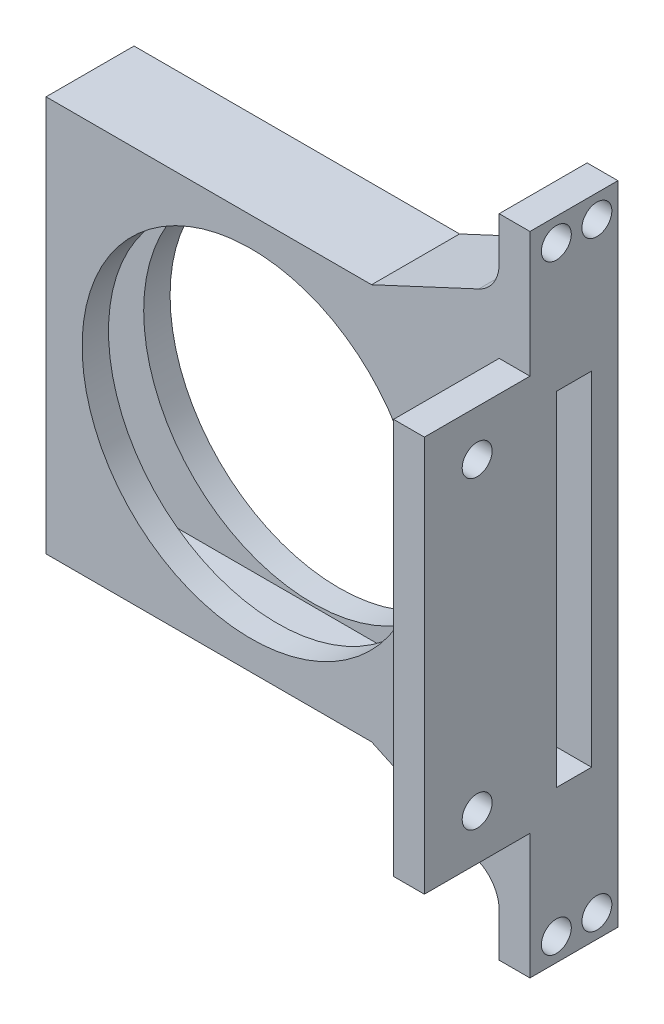
ISO-10303-21;
HEADER;
FILE_DESCRIPTION(('STEP AP214'),'2;1');
FILE_NAME('part.step','',(''),(''),'','','');
FILE_SCHEMA(('AUTOMOTIVE_DESIGN { 1 0 10303 214 1 1 1 1 }'));
ENDSEC;
DATA;
#1=APPLICATION_CONTEXT('core data for automotive mechanical design processes');
#2=APPLICATION_PROTOCOL_DEFINITION('international standard','automotive_design',2000,#1);
#3=PRODUCT_CONTEXT('',#1,'mechanical');
#4=PRODUCT('Part','Part','',(#3));
#5=PRODUCT_RELATED_PRODUCT_CATEGORY('part','',(#4));
#6=PRODUCT_DEFINITION_FORMATION('','',#4);
#7=PRODUCT_DEFINITION_CONTEXT('part definition',#1,'design');
#8=PRODUCT_DEFINITION('design','',#6,#7);
#9=PRODUCT_DEFINITION_SHAPE('','',#8);
#10=(LENGTH_UNIT() NAMED_UNIT(*) SI_UNIT(.MILLI.,.METRE.));
#11=(NAMED_UNIT(*) PLANE_ANGLE_UNIT() SI_UNIT($,.RADIAN.));
#12=(NAMED_UNIT(*) SI_UNIT($,.STERADIAN.) SOLID_ANGLE_UNIT());
#13=UNCERTAINTY_MEASURE_WITH_UNIT(LENGTH_MEASURE(1.E-05),#10,'distance_accuracy_value','');
#14=(GEOMETRIC_REPRESENTATION_CONTEXT(3) GLOBAL_UNCERTAINTY_ASSIGNED_CONTEXT((#13)) GLOBAL_UNIT_ASSIGNED_CONTEXT((#10,
#11,#12)) REPRESENTATION_CONTEXT('',''));
#15=CARTESIAN_POINT('',(0.,0.,0.));
#16=DIRECTION('',(0.,0.,1.));
#17=DIRECTION('',(1.,0.,0.));
#18=AXIS2_PLACEMENT_3D('',#15,#16,#17);
#19=CARTESIAN_POINT('',(-27.5,22.5,3.));
#20=DIRECTION('',(0.,-1.,0.));
#21=DIRECTION('',(0.,0.,-1.));
#22=AXIS2_PLACEMENT_3D('',#19,#20,#21);
#23=PLANE('',#22);
#24=DIRECTION('',(0.,0.,1.));
#25=VECTOR('',#24,1.);
#26=CARTESIAN_POINT('',(9.50000000000001,22.5,-7.));
#27=LINE('',#26,#25);
#28=CARTESIAN_POINT('',(9.50000000000001,22.5,-7.));
#29=VERTEX_POINT('',#28);
#30=CARTESIAN_POINT('',(9.50000000000001,22.5,3.));
#31=VERTEX_POINT('',#30);
#32=EDGE_CURVE('E11',#29,#31,#27,.T.);
#33=ORIENTED_EDGE('',*,*,#32,.F.);
#34=DIRECTION('',(-1.,0.,0.));
#35=VECTOR('',#34,1.);
#36=CARTESIAN_POINT('',(-27.5,22.5,-7.));
#37=LINE('',#36,#35);
#38=CARTESIAN_POINT('',(-27.5,22.5,-7.));
#39=VERTEX_POINT('',#38);
#40=EDGE_CURVE('E200',#29,#39,#37,.T.);
#41=ORIENTED_EDGE('',*,*,#40,.T.);
#42=DIRECTION('',(0.,0.,-1.));
#43=VECTOR('',#42,1.);
#44=CARTESIAN_POINT('',(-27.5,22.5,3.));
#45=LINE('',#44,#43);
#46=CARTESIAN_POINT('',(-27.5,22.5,3.));
#47=VERTEX_POINT('',#46);
#48=EDGE_CURVE('E182',#47,#39,#45,.T.);
#49=ORIENTED_EDGE('',*,*,#48,.F.);
#50=DIRECTION('',(-1.,0.,0.));
#51=VECTOR('',#50,1.);
#52=CARTESIAN_POINT('',(-27.5,22.5,3.));
#53=LINE('',#52,#51);
#54=EDGE_CURVE('E341',#31,#47,#53,.T.);
#55=ORIENTED_EDGE('',*,*,#54,.F.);
#56=EDGE_LOOP('',(#33,#41,#49,#55));
#57=FACE_BOUND('',#56,.T.);
#58=ADVANCED_FACE('F34',(#57),#23,.F.);
#59=CARTESIAN_POINT('',(-27.5,-22.5,3.));
#60=DIRECTION('',(0.,1.,0.));
#61=DIRECTION('',(0.,0.,1.));
#62=AXIS2_PLACEMENT_3D('',#59,#60,#61);
#63=PLANE('',#62);
#64=DIRECTION('',(-1.,0.,0.));
#65=VECTOR('',#64,1.);
#66=CARTESIAN_POINT('',(27.5,-22.5,3.));
#67=LINE('',#66,#65);
#68=CARTESIAN_POINT('',(27.5,-22.5,3.));
#69=VERTEX_POINT('',#68);
#70=CARTESIAN_POINT('',(24.,-22.5,3.));
#71=VERTEX_POINT('',#70);
#72=EDGE_CURVE('E273',#69,#71,#67,.T.);
#73=ORIENTED_EDGE('',*,*,#72,.F.);
#74=DIRECTION('',(0.,0.,-1.));
#75=VECTOR('',#74,1.);
#76=CARTESIAN_POINT('',(27.5,-22.5,3.));
#77=LINE('',#76,#75);
#78=CARTESIAN_POINT('',(27.5,-22.5,15.));
#79=VERTEX_POINT('',#78);
#80=EDGE_CURVE('E183',#79,#69,#77,.T.);
#81=ORIENTED_EDGE('',*,*,#80,.F.);
#82=DIRECTION('',(1.,0.,0.));
#83=VECTOR('',#82,1.);
#84=CARTESIAN_POINT('',(24.,-22.5,15.));
#85=LINE('',#84,#83);
#86=CARTESIAN_POINT('',(24.,-22.5,15.));
#87=VERTEX_POINT('',#86);
#88=EDGE_CURVE('E322',#87,#79,#85,.T.);
#89=ORIENTED_EDGE('',*,*,#88,.F.);
#90=DIRECTION('',(0.,0.,-1.));
#91=VECTOR('',#90,1.);
#92=CARTESIAN_POINT('',(24.,-22.5,15.));
#93=LINE('',#92,#91);
#94=EDGE_CURVE('E332',#87,#71,#93,.T.);
#95=ORIENTED_EDGE('',*,*,#94,.T.);
#96=EDGE_LOOP('',(#73,#81,#89,#95));
#97=FACE_BOUND('',#96,.T.);
#98=ADVANCED_FACE('F373',(#97),#63,.F.);
#99=CARTESIAN_POINT('',(27.5,22.5,3.));
#100=DIRECTION('',(-1.,0.,0.));
#101=DIRECTION('',(0.,-1.,0.));
#102=AXIS2_PLACEMENT_3D('',#99,#100,#101);
#103=PLANE('',#102);
#104=DIRECTION('',(0.,0.,1.));
#105=VECTOR('',#104,1.);
#106=CARTESIAN_POINT('',(27.5,-19.5,0.));
#107=LINE('',#106,#105);
#108=CARTESIAN_POINT('',(27.5,-19.5,-4.));
#109=VERTEX_POINT('',#108);
#110=CARTESIAN_POINT('',(27.5,-19.5,0.));
#111=VERTEX_POINT('',#110);
#112=EDGE_CURVE('E747',#109,#111,#107,.T.);
#113=ORIENTED_EDGE('',*,*,#112,.T.);
#114=DIRECTION('',(0.,1.,0.));
#115=VECTOR('',#114,1.);
#116=CARTESIAN_POINT('',(27.5,22.5,0.));
#117=LINE('',#116,#115);
#118=CARTESIAN_POINT('',(27.5,19.5,0.));
#119=VERTEX_POINT('',#118);
#120=EDGE_CURVE('E340',#111,#119,#117,.T.);
#121=ORIENTED_EDGE('',*,*,#120,.T.);
#122=DIRECTION('',(0.,0.,1.));
#123=VECTOR('',#122,1.);
#124=CARTESIAN_POINT('',(27.5,19.5,0.));
#125=LINE('',#124,#123);
#126=CARTESIAN_POINT('',(27.5,19.5,-4.));
#127=VERTEX_POINT('',#126);
#128=EDGE_CURVE('E735',#127,#119,#125,.T.);
#129=ORIENTED_EDGE('',*,*,#128,.F.);
#130=DIRECTION('',(0.,1.,0.));
#131=VECTOR('',#130,1.);
#132=CARTESIAN_POINT('',(27.5,22.5,-4.));
#133=LINE('',#132,#131);
#134=EDGE_CURVE('E206',#109,#127,#133,.T.);
#135=ORIENTED_EDGE('',*,*,#134,.F.);
#136=EDGE_LOOP('',(#113,#121,#129,#135));
#137=FACE_BOUND('',#136,.T.);
#138=CARTESIAN_POINT('',(27.5,34.1294345757057,0.));
#139=DIRECTION('',(1.,0.,0.));
#140=DIRECTION('',(0.,0.,1.));
#141=AXIS2_PLACEMENT_3D('',#138,#139,#140);
#142=CIRCLE('',#141,1.7);
#143=CARTESIAN_POINT('',(27.5,34.1294345757057,1.7));
#144=VERTEX_POINT('',#143);
#145=EDGE_CURVE('E214',#144,#144,#142,.T.);
#146=ORIENTED_EDGE('',*,*,#145,.F.);
#147=EDGE_LOOP('',(#146));
#148=FACE_BOUND('',#147,.T.);
#149=CARTESIAN_POINT('',(27.5,34.1294345757057,-4.60789842364382));
#150=DIRECTION('',(1.,0.,0.));
#151=DIRECTION('',(0.,0.,1.));
#152=AXIS2_PLACEMENT_3D('',#149,#150,#151);
#153=CIRCLE('',#152,1.7);
#154=CARTESIAN_POINT('',(27.5,34.1294345757057,-2.90789842364382));
#155=VERTEX_POINT('',#154);
#156=EDGE_CURVE('E221',#155,#155,#153,.T.);
#157=ORIENTED_EDGE('',*,*,#156,.F.);
#158=EDGE_LOOP('',(#157));
#159=FACE_BOUND('',#158,.T.);
#160=CARTESIAN_POINT('',(27.5,-34.1294345757057,0.));
#161=DIRECTION('',(-1.,0.,0.));
#162=DIRECTION('',(0.,0.,1.));
#163=AXIS2_PLACEMENT_3D('',#160,#161,#162);
#164=CIRCLE('',#163,1.7);
#165=CARTESIAN_POINT('',(27.5,-34.1294345757057,1.7));
#166=VERTEX_POINT('',#165);
#167=EDGE_CURVE('E260',#166,#166,#164,.T.);
#168=ORIENTED_EDGE('',*,*,#167,.T.);
#169=EDGE_LOOP('',(#168));
#170=FACE_BOUND('',#169,.T.);
#171=CARTESIAN_POINT('',(27.5,-34.1294345757057,-4.60789842364382));
#172=DIRECTION('',(-1.,0.,0.));
#173=DIRECTION('',(0.,0.,1.));
#174=AXIS2_PLACEMENT_3D('',#171,#172,#173);
#175=CIRCLE('',#174,1.7);
#176=CARTESIAN_POINT('',(27.5,-34.1294345757057,-2.90789842364382));
#177=VERTEX_POINT('',#176);
#178=EDGE_CURVE('E267',#177,#177,#175,.T.);
#179=ORIENTED_EDGE('',*,*,#178,.T.);
#180=EDGE_LOOP('',(#179));
#181=FACE_BOUND('',#180,.T.);
#182=CARTESIAN_POINT('',(27.5,-17.3,9.));
#183=DIRECTION('',(-1.,0.,0.));
#184=DIRECTION('',(0.,-1.,0.));
#185=AXIS2_PLACEMENT_3D('',#182,#183,#184);
#186=CIRCLE('',#185,1.7);
#187=CARTESIAN_POINT('',(27.5,-19.,9.));
#188=VERTEX_POINT('',#187);
#189=EDGE_CURVE('E310',#188,#188,#186,.T.);
#190=ORIENTED_EDGE('',*,*,#189,.T.);
#191=EDGE_LOOP('',(#190));
#192=FACE_BOUND('',#191,.T.);
#193=CARTESIAN_POINT('',(27.5,17.3,9.));
#194=DIRECTION('',(-1.,0.,0.));
#195=DIRECTION('',(0.,-1.,0.));
#196=AXIS2_PLACEMENT_3D('',#193,#194,#195);
#197=CIRCLE('',#196,1.7);
#198=CARTESIAN_POINT('',(27.5,15.6,9.));
#199=VERTEX_POINT('',#198);
#200=EDGE_CURVE('E317',#199,#199,#197,.T.);
#201=ORIENTED_EDGE('',*,*,#200,.T.);
#202=EDGE_LOOP('',(#201));
#203=FACE_BOUND('',#202,.T.);
#204=DIRECTION('',(0.,1.,0.));
#205=VECTOR('',#204,1.);
#206=CARTESIAN_POINT('',(27.5,-36.7445222988039,-7.));
#207=LINE('',#206,#205);
#208=CARTESIAN_POINT('',(27.5,-36.7445222988039,-7.));
#209=VERTEX_POINT('',#208);
#210=CARTESIAN_POINT('',(27.5,36.7445222988039,-7.));
#211=VERTEX_POINT('',#210);
#212=EDGE_CURVE('E287',#209,#211,#207,.T.);
#213=ORIENTED_EDGE('',*,*,#212,.T.);
#214=DIRECTION('',(0.,0.,1.));
#215=VECTOR('',#214,1.);
#216=CARTESIAN_POINT('',(27.5,36.7445222988039,-7.));
#217=LINE('',#216,#215);
#218=CARTESIAN_POINT('',(27.5,36.7445222988039,3.));
#219=VERTEX_POINT('',#218);
#220=EDGE_CURVE('E250',#211,#219,#217,.T.);
#221=ORIENTED_EDGE('',*,*,#220,.T.);
#222=DIRECTION('',(0.,-1.,0.));
#223=VECTOR('',#222,1.);
#224=CARTESIAN_POINT('',(27.5,36.7445222988039,3.));
#225=LINE('',#224,#223);
#226=CARTESIAN_POINT('',(27.5,22.5,3.));
#227=VERTEX_POINT('',#226);
#228=EDGE_CURVE('E217',#219,#227,#225,.T.);
#229=ORIENTED_EDGE('',*,*,#228,.T.);
#230=DIRECTION('',(0.,0.,-1.));
#231=VECTOR('',#230,1.);
#232=CARTESIAN_POINT('',(27.5,22.5,3.));
#233=LINE('',#232,#231);
#234=CARTESIAN_POINT('',(27.5,22.5,15.));
#235=VERTEX_POINT('',#234);
#236=EDGE_CURVE('E309',#235,#227,#233,.T.);
#237=ORIENTED_EDGE('',*,*,#236,.F.);
#238=DIRECTION('',(0.,1.,0.));
#239=VECTOR('',#238,1.);
#240=CARTESIAN_POINT('',(27.5,-22.5,15.));
#241=LINE('',#240,#239);
#242=EDGE_CURVE('E325',#79,#235,#241,.T.);
#243=ORIENTED_EDGE('',*,*,#242,.F.);
#244=ORIENTED_EDGE('',*,*,#80,.T.);
#245=DIRECTION('',(0.,1.,0.));
#246=VECTOR('',#245,1.);
#247=CARTESIAN_POINT('',(27.5,-36.7445222988039,3.));
#248=LINE('',#247,#246);
#249=CARTESIAN_POINT('',(27.5,-36.7445222988039,3.));
#250=VERTEX_POINT('',#249);
#251=EDGE_CURVE('E263',#250,#69,#248,.T.);
#252=ORIENTED_EDGE('',*,*,#251,.F.);
#253=DIRECTION('',(0.,0.,1.));
#254=VECTOR('',#253,1.);
#255=CARTESIAN_POINT('',(27.5,-36.7445222988039,-7.));
#256=LINE('',#255,#254);
#257=EDGE_CURVE('E300',#209,#250,#256,.T.);
#258=ORIENTED_EDGE('',*,*,#257,.F.);
#259=EDGE_LOOP('',(#213,#221,#229,#237,#243,#244,#252,#258));
#260=FACE_BOUND('',#259,.T.);
#261=ADVANCED_FACE('F36',(#137,#148,#159,#170,#181,#192,#203,#260),#103,.F.);
#262=ORIENTED_EDGE('',*,*,#236,.T.);
#263=DIRECTION('',(-1.,0.,0.));
#264=VECTOR('',#263,1.);
#265=CARTESIAN_POINT('',(27.5,22.5,3.));
#266=LINE('',#265,#264);
#267=CARTESIAN_POINT('',(24.,22.5,3.));
#268=VERTEX_POINT('',#267);
#269=EDGE_CURVE('E240',#227,#268,#266,.T.);
#270=ORIENTED_EDGE('',*,*,#269,.T.);
#271=DIRECTION('',(0.,0.,-1.));
#272=VECTOR('',#271,1.);
#273=CARTESIAN_POINT('',(24.,22.5,15.));
#274=LINE('',#273,#272);
#275=CARTESIAN_POINT('',(24.,22.5,15.));
#276=VERTEX_POINT('',#275);
#277=EDGE_CURVE('E337',#276,#268,#274,.T.);
#278=ORIENTED_EDGE('',*,*,#277,.F.);
#279=DIRECTION('',(-1.,0.,0.));
#280=VECTOR('',#279,1.);
#281=CARTESIAN_POINT('',(27.5,22.5,15.));
#282=LINE('',#281,#280);
#283=EDGE_CURVE('E328',#235,#276,#282,.T.);
#284=ORIENTED_EDGE('',*,*,#283,.F.);
#285=EDGE_LOOP('',(#262,#270,#278,#284));
#286=FACE_BOUND('',#285,.T.);
#287=ADVANCED_FACE('F375',(#286),#23,.F.);
#288=CARTESIAN_POINT('',(-27.5,22.5,3.));
#289=DIRECTION('',(1.,0.,0.));
#290=DIRECTION('',(0.,1.,0.));
#291=AXIS2_PLACEMENT_3D('',#288,#289,#290);
#292=PLANE('',#291);
#293=DIRECTION('',(0.,0.,-1.));
#294=VECTOR('',#293,1.);
#295=CARTESIAN_POINT('',(-27.5,19.5,-4.));
#296=LINE('',#295,#294);
#297=CARTESIAN_POINT('',(-27.5,19.5,0.));
#298=VERTEX_POINT('',#297);
#299=CARTESIAN_POINT('',(-27.5,19.5,-4.));
#300=VERTEX_POINT('',#299);
#301=EDGE_CURVE('E737',#298,#300,#296,.T.);
#302=ORIENTED_EDGE('',*,*,#301,.F.);
#303=DIRECTION('',(0.,-1.,0.));
#304=VECTOR('',#303,1.);
#305=CARTESIAN_POINT('',(-27.5,22.5,0.));
#306=LINE('',#305,#304);
#307=CARTESIAN_POINT('',(-27.5,-19.5,0.));
#308=VERTEX_POINT('',#307);
#309=EDGE_CURVE('E51',#298,#308,#306,.T.);
#310=ORIENTED_EDGE('',*,*,#309,.T.);
#311=DIRECTION('',(0.,0.,-1.));
#312=VECTOR('',#311,1.);
#313=CARTESIAN_POINT('',(-27.5,-19.5,-4.));
#314=LINE('',#313,#312);
#315=CARTESIAN_POINT('',(-27.5,-19.5,-4.));
#316=VERTEX_POINT('',#315);
#317=EDGE_CURVE('E752',#308,#316,#314,.T.);
#318=ORIENTED_EDGE('',*,*,#317,.T.);
#319=DIRECTION('',(0.,-1.,0.));
#320=VECTOR('',#319,1.);
#321=CARTESIAN_POINT('',(-27.5,22.5,-4.));
#322=LINE('',#321,#320);
#323=EDGE_CURVE('E195',#300,#316,#322,.T.);
#324=ORIENTED_EDGE('',*,*,#323,.F.);
#325=EDGE_LOOP('',(#302,#310,#318,#324));
#326=FACE_BOUND('',#325,.T.);
#327=ORIENTED_EDGE('',*,*,#48,.T.);
#328=DIRECTION('',(0.,-1.,0.));
#329=VECTOR('',#328,1.);
#330=CARTESIAN_POINT('',(-27.5,22.5,-7.));
#331=LINE('',#330,#329);
#332=CARTESIAN_POINT('',(-27.5,-22.5,-7.));
#333=VERTEX_POINT('',#332);
#334=EDGE_CURVE('E191',#39,#333,#331,.T.);
#335=ORIENTED_EDGE('',*,*,#334,.T.);
#336=DIRECTION('',(0.,0.,-1.));
#337=VECTOR('',#336,1.);
#338=CARTESIAN_POINT('',(-27.5,-22.5,3.));
#339=LINE('',#338,#337);
#340=CARTESIAN_POINT('',(-27.5,-22.5,3.));
#341=VERTEX_POINT('',#340);
#342=EDGE_CURVE('E172',#341,#333,#339,.T.);
#343=ORIENTED_EDGE('',*,*,#342,.F.);
#344=DIRECTION('',(0.,-1.,0.));
#345=VECTOR('',#344,1.);
#346=CARTESIAN_POINT('',(-27.5,22.5,3.));
#347=LINE('',#346,#345);
#348=EDGE_CURVE('E343',#47,#341,#347,.T.);
#349=ORIENTED_EDGE('',*,*,#348,.F.);
#350=EDGE_LOOP('',(#327,#335,#343,#349));
#351=FACE_BOUND('',#350,.T.);
#352=ADVANCED_FACE('F197',(#326,#351),#292,.F.);
#353=ORIENTED_EDGE('',*,*,#342,.T.);
#354=DIRECTION('',(1.,0.,0.));
#355=VECTOR('',#354,1.);
#356=CARTESIAN_POINT('',(-27.5,-22.5,-7.));
#357=LINE('',#356,#355);
#358=CARTESIAN_POINT('',(9.50000000000001,-22.5,-7.));
#359=VERTEX_POINT('',#358);
#360=EDGE_CURVE('E176',#333,#359,#357,.T.);
#361=ORIENTED_EDGE('',*,*,#360,.T.);
#362=DIRECTION('',(0.,0.,1.));
#363=VECTOR('',#362,1.);
#364=CARTESIAN_POINT('',(9.50000000000001,-22.5,-7.));
#365=LINE('',#364,#363);
#366=CARTESIAN_POINT('',(9.50000000000001,-22.5,3.));
#367=VERTEX_POINT('',#366);
#368=EDGE_CURVE('E43',#359,#367,#365,.T.);
#369=ORIENTED_EDGE('',*,*,#368,.T.);
#370=DIRECTION('',(1.,0.,0.));
#371=VECTOR('',#370,1.);
#372=CARTESIAN_POINT('',(-27.5,-22.5,3.));
#373=LINE('',#372,#371);
#374=EDGE_CURVE('E178',#341,#367,#373,.T.);
#375=ORIENTED_EDGE('',*,*,#374,.F.);
#376=EDGE_LOOP('',(#353,#361,#369,#375));
#377=FACE_BOUND('',#376,.T.);
#378=ADVANCED_FACE('F174',(#377),#63,.F.);
#379=CARTESIAN_POINT('',(0.,0.,3.));
#380=DIRECTION('',(0.,0.,1.));
#381=DIRECTION('',(1.,0.,0.));
#382=AXIS2_PLACEMENT_3D('',#379,#380,#381);
#383=PLANE('',#382);
#384=CARTESIAN_POINT('',(-4.20497735726996,0.,3.));
#385=DIRECTION('',(0.,0.,1.));
#386=DIRECTION('',(1.,0.,0.));
#387=AXIS2_PLACEMENT_3D('',#384,#385,#386);
#388=CIRCLE('',#387,19.2);
#389=CARTESIAN_POINT('',(14.99502264273,0.,3.));
#390=VERTEX_POINT('',#389);
#391=EDGE_CURVE('E210',#390,#390,#388,.T.);
#392=ORIENTED_EDGE('',*,*,#391,.F.);
#393=EDGE_LOOP('',(#392));
#394=FACE_BOUND('',#393,.T.);
#395=DIRECTION('',(0.,-1.,0.));
#396=VECTOR('',#395,1.);
#397=CARTESIAN_POINT('',(24.,22.5,3.));
#398=LINE('',#397,#396);
#399=EDGE_CURVE('E313',#268,#71,#398,.T.);
#400=ORIENTED_EDGE('',*,*,#399,.F.);
#401=ORIENTED_EDGE('',*,*,#269,.F.);
#402=ORIENTED_EDGE('',*,*,#228,.F.);
#403=DIRECTION('',(1.,0.,0.));
#404=VECTOR('',#403,1.);
#405=CARTESIAN_POINT('',(27.5,36.7445222988039,3.));
#406=LINE('',#405,#404);
#407=CARTESIAN_POINT('',(24.,36.7445222988039,3.));
#408=VERTEX_POINT('',#407);
#409=EDGE_CURVE('E228',#408,#219,#406,.T.);
#410=ORIENTED_EDGE('',*,*,#409,.F.);
#411=DIRECTION('',(0.,1.,0.));
#412=VECTOR('',#411,1.);
#413=CARTESIAN_POINT('',(24.,36.7445222988039,3.));
#414=LINE('',#413,#412);
#415=CARTESIAN_POINT('',(24.,31.8046874169359,3.));
#416=VERTEX_POINT('',#415);
#417=EDGE_CURVE('E231',#416,#408,#414,.T.);
#418=ORIENTED_EDGE('',*,*,#417,.F.);
#419=CARTESIAN_POINT('',(20.,31.8046874169359,3.));
#420=DIRECTION('',(0.,0.,1.));
#421=DIRECTION('',(1.,0.,0.));
#422=AXIS2_PLACEMENT_3D('',#419,#420,#421);
#423=CIRCLE('',#422,4.);
#424=CARTESIAN_POINT('',(21.6892379962709,28.1788806112781,3.));
#425=VERTEX_POINT('',#424);
#426=EDGE_CURVE('E234',#425,#416,#423,.T.);
#427=ORIENTED_EDGE('',*,*,#426,.F.);
#428=DIRECTION('',(0.906451701414455,0.422309499067733,0.));
#429=VECTOR('',#428,1.);
#430=CARTESIAN_POINT('',(9.50000000000001,22.5,3.));
#431=LINE('',#430,#429);
#432=EDGE_CURVE('E237',#31,#425,#431,.T.);
#433=ORIENTED_EDGE('',*,*,#432,.F.);
#434=ORIENTED_EDGE('',*,*,#54,.T.);
#435=ORIENTED_EDGE('',*,*,#348,.T.);
#436=ORIENTED_EDGE('',*,*,#374,.T.);
#437=DIRECTION('',(0.906451701414455,-0.422309499067733,0.));
#438=VECTOR('',#437,1.);
#439=CARTESIAN_POINT('',(9.50000000000001,-22.5,3.));
#440=LINE('',#439,#438);
#441=CARTESIAN_POINT('',(21.6892379962709,-28.1788806112781,3.));
#442=VERTEX_POINT('',#441);
#443=EDGE_CURVE('E275',#367,#442,#440,.T.);
#444=ORIENTED_EDGE('',*,*,#443,.T.);
#445=CARTESIAN_POINT('',(20.,-31.8046874169359,3.));
#446=DIRECTION('',(0.,0.,-1.));
#447=DIRECTION('',(1.,0.,0.));
#448=AXIS2_PLACEMENT_3D('',#445,#446,#447);
#449=CIRCLE('',#448,4.);
#450=CARTESIAN_POINT('',(24.,-31.8046874169359,3.));
#451=VERTEX_POINT('',#450);
#452=EDGE_CURVE('E278',#442,#451,#449,.T.);
#453=ORIENTED_EDGE('',*,*,#452,.T.);
#454=DIRECTION('',(0.,-1.,0.));
#455=VECTOR('',#454,1.);
#456=CARTESIAN_POINT('',(24.,-36.7445222988039,3.));
#457=LINE('',#456,#455);
#458=CARTESIAN_POINT('',(24.,-36.7445222988039,3.));
#459=VERTEX_POINT('',#458);
#460=EDGE_CURVE('E281',#451,#459,#457,.T.);
#461=ORIENTED_EDGE('',*,*,#460,.T.);
#462=DIRECTION('',(1.,0.,0.));
#463=VECTOR('',#462,1.);
#464=CARTESIAN_POINT('',(27.5,-36.7445222988039,3.));
#465=LINE('',#464,#463);
#466=EDGE_CURVE('E284',#459,#250,#465,.T.);
#467=ORIENTED_EDGE('',*,*,#466,.T.);
#468=ORIENTED_EDGE('',*,*,#251,.T.);
#469=ORIENTED_EDGE('',*,*,#72,.T.);
#470=EDGE_LOOP('',(#400,#401,#402,#410,#418,#427,#433,#434,#435,#436,#444,#453,#461,#467,#468,#469));
#471=FACE_BOUND('',#470,.T.);
#472=ADVANCED_FACE('F400',(#394,#471),#383,.T.);
#473=CARTESIAN_POINT('',(0.,0.,0.));
#474=DIRECTION('',(0.,0.,1.));
#475=DIRECTION('',(1.,0.,0.));
#476=AXIS2_PLACEMENT_3D('',#473,#474,#475);
#477=PLANE('',#476);
#478=CARTESIAN_POINT('',(-4.20497735726996,0.,0.));
#479=DIRECTION('',(0.,0.,1.));
#480=DIRECTION('',(1.,0.,0.));
#481=AXIS2_PLACEMENT_3D('',#478,#479,#480);
#482=CIRCLE('',#481,19.2);
#483=CARTESIAN_POINT('',(14.99502264273,0.,0.));
#484=VERTEX_POINT('',#483);
#485=EDGE_CURVE('E202',#484,#484,#482,.T.);
#486=ORIENTED_EDGE('',*,*,#485,.T.);
#487=EDGE_LOOP('',(#486));
#488=FACE_BOUND('',#487,.T.);
#489=ORIENTED_EDGE('',*,*,#309,.F.);
#490=DIRECTION('',(-1.,0.,0.));
#491=VECTOR('',#490,1.);
#492=CARTESIAN_POINT('',(-27.5,19.5,0.));
#493=LINE('',#492,#491);
#494=EDGE_CURVE('E55',#119,#298,#493,.T.);
#495=ORIENTED_EDGE('',*,*,#494,.F.);
#496=ORIENTED_EDGE('',*,*,#120,.F.);
#497=DIRECTION('',(-1.,0.,0.));
#498=VECTOR('',#497,1.);
#499=CARTESIAN_POINT('',(-27.5,-19.5,0.));
#500=LINE('',#499,#498);
#501=EDGE_CURVE('E750',#111,#308,#500,.T.);
#502=ORIENTED_EDGE('',*,*,#501,.T.);
#503=EDGE_LOOP('',(#489,#495,#496,#502));
#504=FACE_BOUND('',#503,.T.);
#505=ADVANCED_FACE('F354',(#488,#504),#477,.F.);
#506=CARTESIAN_POINT('',(24.,22.5,15.));
#507=DIRECTION('',(1.,0.,0.));
#508=DIRECTION('',(0.,1.,0.));
#509=AXIS2_PLACEMENT_3D('',#506,#507,#508);
#510=PLANE('',#509);
#511=CARTESIAN_POINT('',(24.,-17.3,9.));
#512=DIRECTION('',(-1.,0.,0.));
#513=DIRECTION('',(0.,-1.,0.));
#514=AXIS2_PLACEMENT_3D('',#511,#512,#513);
#515=CIRCLE('',#514,1.7);
#516=CARTESIAN_POINT('',(24.,-19.,9.));
#517=VERTEX_POINT('',#516);
#518=EDGE_CURVE('E314',#517,#517,#515,.T.);
#519=ORIENTED_EDGE('',*,*,#518,.F.);
#520=EDGE_LOOP('',(#519));
#521=FACE_BOUND('',#520,.T.);
#522=CARTESIAN_POINT('',(24.,17.3,9.));
#523=DIRECTION('',(-1.,0.,0.));
#524=DIRECTION('',(0.,-1.,0.));
#525=AXIS2_PLACEMENT_3D('',#522,#523,#524);
#526=CIRCLE('',#525,1.7);
#527=CARTESIAN_POINT('',(24.,15.6,9.));
#528=VERTEX_POINT('',#527);
#529=EDGE_CURVE('E302',#528,#528,#526,.T.);
#530=ORIENTED_EDGE('',*,*,#529,.F.);
#531=EDGE_LOOP('',(#530));
#532=FACE_BOUND('',#531,.T.);
#533=ORIENTED_EDGE('',*,*,#399,.T.);
#534=ORIENTED_EDGE('',*,*,#94,.F.);
#535=DIRECTION('',(0.,-1.,0.));
#536=VECTOR('',#535,1.);
#537=CARTESIAN_POINT('',(24.,22.5,15.));
#538=LINE('',#537,#536);
#539=EDGE_CURVE('E330',#276,#87,#538,.T.);
#540=ORIENTED_EDGE('',*,*,#539,.F.);
#541=ORIENTED_EDGE('',*,*,#277,.T.);
#542=EDGE_LOOP('',(#533,#534,#540,#541));
#543=FACE_BOUND('',#542,.T.);
#544=ADVANCED_FACE('F405',(#521,#532,#543),#510,.F.);
#545=CARTESIAN_POINT('',(0.,0.,15.));
#546=DIRECTION('',(0.,0.,1.));
#547=DIRECTION('',(1.,0.,0.));
#548=AXIS2_PLACEMENT_3D('',#545,#546,#547);
#549=PLANE('',#548);
#550=ORIENTED_EDGE('',*,*,#88,.T.);
#551=ORIENTED_EDGE('',*,*,#242,.T.);
#552=ORIENTED_EDGE('',*,*,#283,.T.);
#553=ORIENTED_EDGE('',*,*,#539,.T.);
#554=EDGE_LOOP('',(#550,#551,#552,#553));
#555=FACE_BOUND('',#554,.T.);
#556=ADVANCED_FACE('F408',(#555),#549,.T.);
#557=CARTESIAN_POINT('',(27.5,17.3,9.));
#558=DIRECTION('',(-1.,0.,0.));
#559=DIRECTION('',(0.,-1.,0.));
#560=AXIS2_PLACEMENT_3D('',#557,#558,#559);
#561=CYLINDRICAL_SURFACE('',#560,1.7);
#562=ORIENTED_EDGE('',*,*,#200,.F.);
#563=EDGE_LOOP('',(#562));
#564=FACE_BOUND('',#563,.T.);
#565=ORIENTED_EDGE('',*,*,#529,.T.);
#566=EDGE_LOOP('',(#565));
#567=FACE_BOUND('',#566,.T.);
#568=ADVANCED_FACE('F459',(#564,#567),#561,.F.);
#569=CARTESIAN_POINT('',(27.5,-17.3,9.));
#570=DIRECTION('',(-1.,0.,0.));
#571=DIRECTION('',(0.,-1.,0.));
#572=AXIS2_PLACEMENT_3D('',#569,#570,#571);
#573=CYLINDRICAL_SURFACE('',#572,1.7);
#574=ORIENTED_EDGE('',*,*,#189,.F.);
#575=EDGE_LOOP('',(#574));
#576=FACE_BOUND('',#575,.T.);
#577=ORIENTED_EDGE('',*,*,#518,.T.);
#578=EDGE_LOOP('',(#577));
#579=FACE_BOUND('',#578,.T.);
#580=ADVANCED_FACE('F449',(#576,#579),#573,.F.);
#581=CARTESIAN_POINT('',(27.5,-36.7445222988039,-7.));
#582=DIRECTION('',(0.,-1.,0.));
#583=DIRECTION('',(1.,0.,0.));
#584=AXIS2_PLACEMENT_3D('',#581,#582,#583);
#585=PLANE('',#584);
#586=ORIENTED_EDGE('',*,*,#257,.T.);
#587=ORIENTED_EDGE('',*,*,#466,.F.);
#588=DIRECTION('',(0.,0.,1.));
#589=VECTOR('',#588,1.);
#590=CARTESIAN_POINT('',(24.,-36.7445222988039,-7.));
#591=LINE('',#590,#589);
#592=CARTESIAN_POINT('',(24.,-36.7445222988039,-7.));
#593=VERTEX_POINT('',#592);
#594=EDGE_CURVE('E303',#593,#459,#591,.T.);
#595=ORIENTED_EDGE('',*,*,#594,.F.);
#596=DIRECTION('',(1.,0.,0.));
#597=VECTOR('',#596,1.);
#598=CARTESIAN_POINT('',(27.5,-36.7445222988039,-7.));
#599=LINE('',#598,#597);
#600=EDGE_CURVE('E296',#593,#209,#599,.T.);
#601=ORIENTED_EDGE('',*,*,#600,.T.);
#602=EDGE_LOOP('',(#586,#587,#595,#601));
#603=FACE_BOUND('',#602,.T.);
#604=ADVANCED_FACE('F413',(#603),#585,.T.);
#605=CARTESIAN_POINT('',(24.,-36.7445222988039,-7.));
#606=DIRECTION('',(-1.,0.,0.));
#607=DIRECTION('',(0.,-1.,0.));
#608=AXIS2_PLACEMENT_3D('',#605,#606,#607);
#609=PLANE('',#608);
#610=CARTESIAN_POINT('',(24.,-34.1294345757057,0.));
#611=DIRECTION('',(-1.,0.,0.));
#612=DIRECTION('',(0.,0.,1.));
#613=AXIS2_PLACEMENT_3D('',#610,#611,#612);
#614=CIRCLE('',#613,1.7);
#615=CARTESIAN_POINT('',(24.,-34.1294345757057,1.7));
#616=VERTEX_POINT('',#615);
#617=EDGE_CURVE('E264',#616,#616,#614,.T.);
#618=ORIENTED_EDGE('',*,*,#617,.F.);
#619=EDGE_LOOP('',(#618));
#620=FACE_BOUND('',#619,.T.);
#621=CARTESIAN_POINT('',(24.,-34.1294345757057,-4.60789842364382));
#622=DIRECTION('',(-1.,0.,0.));
#623=DIRECTION('',(0.,0.,1.));
#624=AXIS2_PLACEMENT_3D('',#621,#622,#623);
#625=CIRCLE('',#624,1.7);
#626=CARTESIAN_POINT('',(24.,-34.1294345757057,-2.90789842364382));
#627=VERTEX_POINT('',#626);
#628=EDGE_CURVE('E254',#627,#627,#625,.T.);
#629=ORIENTED_EDGE('',*,*,#628,.F.);
#630=EDGE_LOOP('',(#629));
#631=FACE_BOUND('',#630,.T.);
#632=ORIENTED_EDGE('',*,*,#594,.T.);
#633=ORIENTED_EDGE('',*,*,#460,.F.);
#634=DIRECTION('',(0.,0.,1.));
#635=VECTOR('',#634,1.);
#636=CARTESIAN_POINT('',(24.,-31.8046874169359,-7.));
#637=LINE('',#636,#635);
#638=CARTESIAN_POINT('',(24.,-31.8046874169359,-7.));
#639=VERTEX_POINT('',#638);
#640=EDGE_CURVE('E305',#639,#451,#637,.T.);
#641=ORIENTED_EDGE('',*,*,#640,.F.);
#642=DIRECTION('',(0.,-1.,0.));
#643=VECTOR('',#642,1.);
#644=CARTESIAN_POINT('',(24.,-36.7445222988039,-7.));
#645=LINE('',#644,#643);
#646=EDGE_CURVE('E293',#639,#593,#645,.T.);
#647=ORIENTED_EDGE('',*,*,#646,.T.);
#648=EDGE_LOOP('',(#632,#633,#641,#647));
#649=FACE_BOUND('',#648,.T.);
#650=ADVANCED_FACE('F439',(#620,#631,#649),#609,.T.);
#651=CARTESIAN_POINT('',(20.,-31.8046874169359,-7.));
#652=DIRECTION('',(0.,0.,1.));
#653=DIRECTION('',(1.,0.,0.));
#654=AXIS2_PLACEMENT_3D('',#651,#652,#653);
#655=CYLINDRICAL_SURFACE('',#654,4.);
#656=ORIENTED_EDGE('',*,*,#640,.T.);
#657=ORIENTED_EDGE('',*,*,#452,.F.);
#658=DIRECTION('',(0.,0.,1.));
#659=VECTOR('',#658,1.);
#660=CARTESIAN_POINT('',(21.6892379962709,-28.1788806112781,-7.));
#661=LINE('',#660,#659);
#662=CARTESIAN_POINT('',(21.6892379962709,-28.1788806112781,-7.));
#663=VERTEX_POINT('',#662);
#664=EDGE_CURVE('E299',#663,#442,#661,.T.);
#665=ORIENTED_EDGE('',*,*,#664,.F.);
#666=CARTESIAN_POINT('',(20.,-31.8046874169359,-7.));
#667=DIRECTION('',(0.,0.,-1.));
#668=DIRECTION('',(1.,0.,0.));
#669=AXIS2_PLACEMENT_3D('',#666,#667,#668);
#670=CIRCLE('',#669,4.);
#671=EDGE_CURVE('E290',#663,#639,#670,.T.);
#672=ORIENTED_EDGE('',*,*,#671,.T.);
#673=EDGE_LOOP('',(#656,#657,#665,#672));
#674=FACE_BOUND('',#673,.T.);
#675=ADVANCED_FACE('F437',(#674),#655,.F.);
#676=CARTESIAN_POINT('',(9.50000000000001,-22.5,-7.));
#677=DIRECTION('',(-0.422309499067733,-0.906451701414455,0.));
#678=DIRECTION('',(0.906451701414455,-0.422309499067733,0.));
#679=AXIS2_PLACEMENT_3D('',#676,#677,#678);
#680=PLANE('',#679);
#681=ORIENTED_EDGE('',*,*,#664,.T.);
#682=ORIENTED_EDGE('',*,*,#443,.F.);
#683=ORIENTED_EDGE('',*,*,#368,.F.);
#684=DIRECTION('',(0.906451701414455,-0.422309499067733,0.));
#685=VECTOR('',#684,1.);
#686=CARTESIAN_POINT('',(9.50000000000001,-22.5,-7.));
#687=LINE('',#686,#685);
#688=EDGE_CURVE('E194',#359,#663,#687,.T.);
#689=ORIENTED_EDGE('',*,*,#688,.T.);
#690=EDGE_LOOP('',(#681,#682,#683,#689));
#691=FACE_BOUND('',#690,.T.);
#692=ADVANCED_FACE('F447',(#691),#680,.T.);
#693=CARTESIAN_POINT('',(20.,-31.8046874169359,-7.));
#694=DIRECTION('',(0.,0.,1.));
#695=DIRECTION('',(1.,0.,0.));
#696=AXIS2_PLACEMENT_3D('',#693,#694,#695);
#697=PLANE('',#696);
#698=CARTESIAN_POINT('',(-4.20497735726996,0.,-7.));
#699=DIRECTION('',(0.,0.,1.));
#700=DIRECTION('',(1.,0.,0.));
#701=AXIS2_PLACEMENT_3D('',#698,#699,#700);
#702=CIRCLE('',#701,19.2);
#703=CARTESIAN_POINT('',(14.99502264273,0.,-7.));
#704=VERTEX_POINT('',#703);
#705=EDGE_CURVE('E208',#704,#704,#702,.F.);
#706=ORIENTED_EDGE('',*,*,#705,.F.);
#707=EDGE_LOOP('',(#706));
#708=FACE_BOUND('',#707,.T.);
#709=ORIENTED_EDGE('',*,*,#212,.F.);
#710=ORIENTED_EDGE('',*,*,#600,.F.);
#711=ORIENTED_EDGE('',*,*,#646,.F.);
#712=ORIENTED_EDGE('',*,*,#671,.F.);
#713=ORIENTED_EDGE('',*,*,#688,.F.);
#714=ORIENTED_EDGE('',*,*,#360,.F.);
#715=ORIENTED_EDGE('',*,*,#334,.F.);
#716=ORIENTED_EDGE('',*,*,#40,.F.);
#717=DIRECTION('',(0.906451701414455,0.422309499067733,0.));
#718=VECTOR('',#717,1.);
#719=CARTESIAN_POINT('',(9.50000000000001,22.5,-7.));
#720=LINE('',#719,#718);
#721=CARTESIAN_POINT('',(21.6892379962709,28.1788806112781,-7.));
#722=VERTEX_POINT('',#721);
#723=EDGE_CURVE('E249',#29,#722,#720,.T.);
#724=ORIENTED_EDGE('',*,*,#723,.T.);
#725=CARTESIAN_POINT('',(20.,31.8046874169359,-7.));
#726=DIRECTION('',(0.,0.,1.));
#727=DIRECTION('',(1.,0.,0.));
#728=AXIS2_PLACEMENT_3D('',#725,#726,#727);
#729=CIRCLE('',#728,4.);
#730=CARTESIAN_POINT('',(24.,31.8046874169359,-7.));
#731=VERTEX_POINT('',#730);
#732=EDGE_CURVE('E247',#722,#731,#729,.T.);
#733=ORIENTED_EDGE('',*,*,#732,.T.);
#734=DIRECTION('',(0.,1.,0.));
#735=VECTOR('',#734,1.);
#736=CARTESIAN_POINT('',(24.,36.7445222988039,-7.));
#737=LINE('',#736,#735);
#738=CARTESIAN_POINT('',(24.,36.7445222988039,-7.));
#739=VERTEX_POINT('',#738);
#740=EDGE_CURVE('E245',#731,#739,#737,.T.);
#741=ORIENTED_EDGE('',*,*,#740,.T.);
#742=DIRECTION('',(1.,0.,0.));
#743=VECTOR('',#742,1.);
#744=CARTESIAN_POINT('',(27.5,36.7445222988039,-7.));
#745=LINE('',#744,#743);
#746=EDGE_CURVE('E242',#739,#211,#745,.T.);
#747=ORIENTED_EDGE('',*,*,#746,.T.);
#748=EDGE_LOOP('',(#709,#710,#711,#712,#713,#714,#715,#716,#724,#733,#741,#747));
#749=FACE_BOUND('',#748,.T.);
#750=ADVANCED_FACE('F189',(#708,#749),#697,.F.);
#751=CARTESIAN_POINT('',(27.5,-34.1294345757057,-4.60789842364382));
#752=DIRECTION('',(-1.,0.,0.));
#753=DIRECTION('',(0.,0.,1.));
#754=AXIS2_PLACEMENT_3D('',#751,#752,#753);
#755=CYLINDRICAL_SURFACE('',#754,1.7);
#756=ORIENTED_EDGE('',*,*,#178,.F.);
#757=EDGE_LOOP('',(#756));
#758=FACE_BOUND('',#757,.T.);
#759=ORIENTED_EDGE('',*,*,#628,.T.);
#760=EDGE_LOOP('',(#759));
#761=FACE_BOUND('',#760,.T.);
#762=ADVANCED_FACE('F531',(#758,#761),#755,.F.);
#763=CARTESIAN_POINT('',(27.5,-34.1294345757057,0.));
#764=DIRECTION('',(-1.,0.,0.));
#765=DIRECTION('',(0.,0.,1.));
#766=AXIS2_PLACEMENT_3D('',#763,#764,#765);
#767=CYLINDRICAL_SURFACE('',#766,1.7);
#768=ORIENTED_EDGE('',*,*,#167,.F.);
#769=EDGE_LOOP('',(#768));
#770=FACE_BOUND('',#769,.T.);
#771=ORIENTED_EDGE('',*,*,#617,.T.);
#772=EDGE_LOOP('',(#771));
#773=FACE_BOUND('',#772,.T.);
#774=ADVANCED_FACE('F536',(#770,#773),#767,.F.);
#775=CARTESIAN_POINT('',(9.50000000000001,22.5,-7.));
#776=DIRECTION('',(0.422309499067733,-0.906451701414455,0.));
#777=DIRECTION('',(0.906451701414455,0.422309499067733,0.));
#778=AXIS2_PLACEMENT_3D('',#775,#776,#777);
#779=PLANE('',#778);
#780=ORIENTED_EDGE('',*,*,#723,.F.);
#781=ORIENTED_EDGE('',*,*,#32,.T.);
#782=ORIENTED_EDGE('',*,*,#432,.T.);
#783=DIRECTION('',(0.,0.,1.));
#784=VECTOR('',#783,1.);
#785=CARTESIAN_POINT('',(21.6892379962709,28.1788806112781,-7.));
#786=LINE('',#785,#784);
#787=EDGE_CURVE('E252',#722,#425,#786,.T.);
#788=ORIENTED_EDGE('',*,*,#787,.F.);
#789=EDGE_LOOP('',(#780,#781,#782,#788));
#790=FACE_BOUND('',#789,.T.);
#791=ADVANCED_FACE('F433',(#790),#779,.F.);
#792=CARTESIAN_POINT('',(20.,31.8046874169359,-7.));
#793=DIRECTION('',(0.,0.,1.));
#794=DIRECTION('',(1.,0.,0.));
#795=AXIS2_PLACEMENT_3D('',#792,#793,#794);
#796=CYLINDRICAL_SURFACE('',#795,4.);
#797=ORIENTED_EDGE('',*,*,#787,.T.);
#798=ORIENTED_EDGE('',*,*,#426,.T.);
#799=DIRECTION('',(0.,0.,1.));
#800=VECTOR('',#799,1.);
#801=CARTESIAN_POINT('',(24.,31.8046874169359,-7.));
#802=LINE('',#801,#800);
#803=EDGE_CURVE('E255',#731,#416,#802,.T.);
#804=ORIENTED_EDGE('',*,*,#803,.F.);
#805=ORIENTED_EDGE('',*,*,#732,.F.);
#806=EDGE_LOOP('',(#797,#798,#804,#805));
#807=FACE_BOUND('',#806,.T.);
#808=ADVANCED_FACE('F428',(#807),#796,.F.);
#809=CARTESIAN_POINT('',(24.,36.7445222988039,-7.));
#810=DIRECTION('',(1.,0.,0.));
#811=DIRECTION('',(0.,1.,0.));
#812=AXIS2_PLACEMENT_3D('',#809,#810,#811);
#813=PLANE('',#812);
#814=CARTESIAN_POINT('',(24.,34.1294345757057,0.));
#815=DIRECTION('',(1.,0.,0.));
#816=DIRECTION('',(0.,0.,1.));
#817=AXIS2_PLACEMENT_3D('',#814,#815,#816);
#818=CIRCLE('',#817,1.7);
#819=CARTESIAN_POINT('',(24.,34.1294345757057,1.7));
#820=VERTEX_POINT('',#819);
#821=EDGE_CURVE('E218',#820,#820,#818,.T.);
#822=ORIENTED_EDGE('',*,*,#821,.T.);
#823=EDGE_LOOP('',(#822));
#824=FACE_BOUND('',#823,.T.);
#825=CARTESIAN_POINT('',(24.,34.1294345757057,-4.60789842364382));
#826=DIRECTION('',(1.,0.,0.));
#827=DIRECTION('',(0.,0.,1.));
#828=AXIS2_PLACEMENT_3D('',#825,#826,#827);
#829=CIRCLE('',#828,1.7);
#830=CARTESIAN_POINT('',(24.,34.1294345757057,-2.90789842364382));
#831=VERTEX_POINT('',#830);
#832=EDGE_CURVE('E213',#831,#831,#829,.T.);
#833=ORIENTED_EDGE('',*,*,#832,.T.);
#834=EDGE_LOOP('',(#833));
#835=FACE_BOUND('',#834,.T.);
#836=ORIENTED_EDGE('',*,*,#803,.T.);
#837=ORIENTED_EDGE('',*,*,#417,.T.);
#838=DIRECTION('',(0.,0.,1.));
#839=VECTOR('',#838,1.);
#840=CARTESIAN_POINT('',(24.,36.7445222988039,-7.));
#841=LINE('',#840,#839);
#842=EDGE_CURVE('E257',#739,#408,#841,.T.);
#843=ORIENTED_EDGE('',*,*,#842,.F.);
#844=ORIENTED_EDGE('',*,*,#740,.F.);
#845=EDGE_LOOP('',(#836,#837,#843,#844));
#846=FACE_BOUND('',#845,.T.);
#847=ADVANCED_FACE('F424',(#824,#835,#846),#813,.F.);
#848=CARTESIAN_POINT('',(27.5,36.7445222988039,-7.));
#849=DIRECTION('',(0.,-1.,0.));
#850=DIRECTION('',(1.,0.,0.));
#851=AXIS2_PLACEMENT_3D('',#848,#849,#850);
#852=PLANE('',#851);
#853=ORIENTED_EDGE('',*,*,#842,.T.);
#854=ORIENTED_EDGE('',*,*,#409,.T.);
#855=ORIENTED_EDGE('',*,*,#220,.F.);
#856=ORIENTED_EDGE('',*,*,#746,.F.);
#857=EDGE_LOOP('',(#853,#854,#855,#856));
#858=FACE_BOUND('',#857,.T.);
#859=ADVANCED_FACE('F420',(#858),#852,.F.);
#860=CARTESIAN_POINT('',(27.5,34.1294345757057,-4.60789842364382));
#861=DIRECTION('',(-1.,0.,0.));
#862=DIRECTION('',(0.,0.,1.));
#863=AXIS2_PLACEMENT_3D('',#860,#861,#862);
#864=CYLINDRICAL_SURFACE('',#863,1.7);
#865=ORIENTED_EDGE('',*,*,#156,.T.);
#866=EDGE_LOOP('',(#865));
#867=FACE_BOUND('',#866,.T.);
#868=ORIENTED_EDGE('',*,*,#832,.F.);
#869=EDGE_LOOP('',(#868));
#870=FACE_BOUND('',#869,.T.);
#871=ADVANCED_FACE('F369',(#867,#870),#864,.F.);
#872=CARTESIAN_POINT('',(27.5,34.1294345757057,0.));
#873=DIRECTION('',(-1.,0.,0.));
#874=DIRECTION('',(0.,0.,1.));
#875=AXIS2_PLACEMENT_3D('',#872,#873,#874);
#876=CYLINDRICAL_SURFACE('',#875,1.7);
#877=ORIENTED_EDGE('',*,*,#145,.T.);
#878=EDGE_LOOP('',(#877));
#879=FACE_BOUND('',#878,.T.);
#880=ORIENTED_EDGE('',*,*,#821,.F.);
#881=EDGE_LOOP('',(#880));
#882=FACE_BOUND('',#881,.T.);
#883=ADVANCED_FACE('F359',(#879,#882),#876,.F.);
#884=CARTESIAN_POINT('',(-4.20497735726996,0.,-7.));
#885=DIRECTION('',(0.,0.,1.));
#886=DIRECTION('',(1.,0.,0.));
#887=AXIS2_PLACEMENT_3D('',#884,#885,#886);
#888=CYLINDRICAL_SURFACE('',#887,19.2);
#889=ORIENTED_EDGE('',*,*,#391,.T.);
#890=EDGE_LOOP('',(#889));
#891=FACE_BOUND('',#890,.T.);
#892=ORIENTED_EDGE('',*,*,#485,.F.);
#893=EDGE_LOOP('',(#892));
#894=FACE_BOUND('',#893,.T.);
#895=ADVANCED_FACE('F356',(#891,#894),#888,.F.);
#896=CARTESIAN_POINT('',(0.,0.,-4.));
#897=DIRECTION('',(0.,0.,-1.));
#898=DIRECTION('',(1.,0.,0.));
#899=AXIS2_PLACEMENT_3D('',#896,#897,#898);
#900=PLANE('',#899);
#901=CARTESIAN_POINT('',(-4.20497735726996,0.,-4.));
#902=DIRECTION('',(0.,0.,-1.));
#903=DIRECTION('',(-1.,0.,0.));
#904=AXIS2_PLACEMENT_3D('',#901,#902,#903);
#905=CIRCLE('',#904,19.2);
#906=CARTESIAN_POINT('',(-23.40497735727,0.,-4.));
#907=VERTEX_POINT('',#906);
#908=EDGE_CURVE('E38',#907,#907,#905,.F.);
#909=ORIENTED_EDGE('',*,*,#908,.F.);
#910=EDGE_LOOP('',(#909));
#911=FACE_BOUND('',#910,.T.);
#912=ORIENTED_EDGE('',*,*,#134,.T.);
#913=DIRECTION('',(1.,0.,0.));
#914=VECTOR('',#913,1.);
#915=CARTESIAN_POINT('',(27.5,19.5,-4.));
#916=LINE('',#915,#914);
#917=EDGE_CURVE('E733',#300,#127,#916,.T.);
#918=ORIENTED_EDGE('',*,*,#917,.F.);
#919=ORIENTED_EDGE('',*,*,#323,.T.);
#920=DIRECTION('',(1.,0.,0.));
#921=VECTOR('',#920,1.);
#922=CARTESIAN_POINT('',(27.5,-19.5,-4.));
#923=LINE('',#922,#921);
#924=EDGE_CURVE('E745',#316,#109,#923,.T.);
#925=ORIENTED_EDGE('',*,*,#924,.T.);
#926=EDGE_LOOP('',(#912,#918,#919,#925));
#927=FACE_BOUND('',#926,.T.);
#928=ADVANCED_FACE('F358',(#911,#927),#900,.F.);
#929=CARTESIAN_POINT('',(-4.20497735726996,0.,15.));
#930=DIRECTION('',(0.,0.,-1.));
#931=DIRECTION('',(-1.,0.,0.));
#932=AXIS2_PLACEMENT_3D('',#929,#930,#931);
#933=CYLINDRICAL_SURFACE('',#932,19.2);
#934=ORIENTED_EDGE('',*,*,#908,.T.);
#935=EDGE_LOOP('',(#934));
#936=FACE_BOUND('',#935,.T.);
#937=ORIENTED_EDGE('',*,*,#705,.T.);
#938=EDGE_LOOP('',(#937));
#939=FACE_BOUND('',#938,.T.);
#940=ADVANCED_FACE('F366',(#936,#939),#933,.F.);
#941=CARTESIAN_POINT('',(0.,-19.5,0.));
#942=DIRECTION('',(0.,1.,0.));
#943=DIRECTION('',(0.,0.,1.));
#944=AXIS2_PLACEMENT_3D('',#941,#942,#943);
#945=PLANE('',#944);
#946=ORIENTED_EDGE('',*,*,#924,.F.);
#947=ORIENTED_EDGE('',*,*,#317,.F.);
#948=ORIENTED_EDGE('',*,*,#501,.F.);
#949=ORIENTED_EDGE('',*,*,#112,.F.);
#950=EDGE_LOOP('',(#946,#947,#948,#949));
#951=FACE_BOUND('',#950,.T.);
#952=ADVANCED_FACE('F681',(#951),#945,.T.);
#953=CARTESIAN_POINT('',(0.,19.5,0.));
#954=DIRECTION('',(0.,-1.,0.));
#955=DIRECTION('',(0.,0.,1.));
#956=AXIS2_PLACEMENT_3D('',#953,#954,#955);
#957=PLANE('',#956);
#958=ORIENTED_EDGE('',*,*,#917,.T.);
#959=ORIENTED_EDGE('',*,*,#128,.T.);
#960=ORIENTED_EDGE('',*,*,#494,.T.);
#961=ORIENTED_EDGE('',*,*,#301,.T.);
#962=EDGE_LOOP('',(#958,#959,#960,#961));
#963=FACE_BOUND('',#962,.T.);
#964=ADVANCED_FACE('F687',(#963),#957,.T.);
#965=CLOSED_SHELL('',(#58,#98,#261,#287,#352,#378,#472,#505,#544,#556,#568,#580,#604,#650,#675,
#692,#750,#762,#774,#791,#808,#847,#859,#871,#883,#895,#928,#940,#952,#964));
#966=MANIFOLD_SOLID_BREP('B2',#965);
#967=ADVANCED_BREP_SHAPE_REPRESENTATION('',(#18,#966),#14);
#968=SHAPE_DEFINITION_REPRESENTATION(#9,#967);
ENDSEC;
END-ISO-10303-21;
